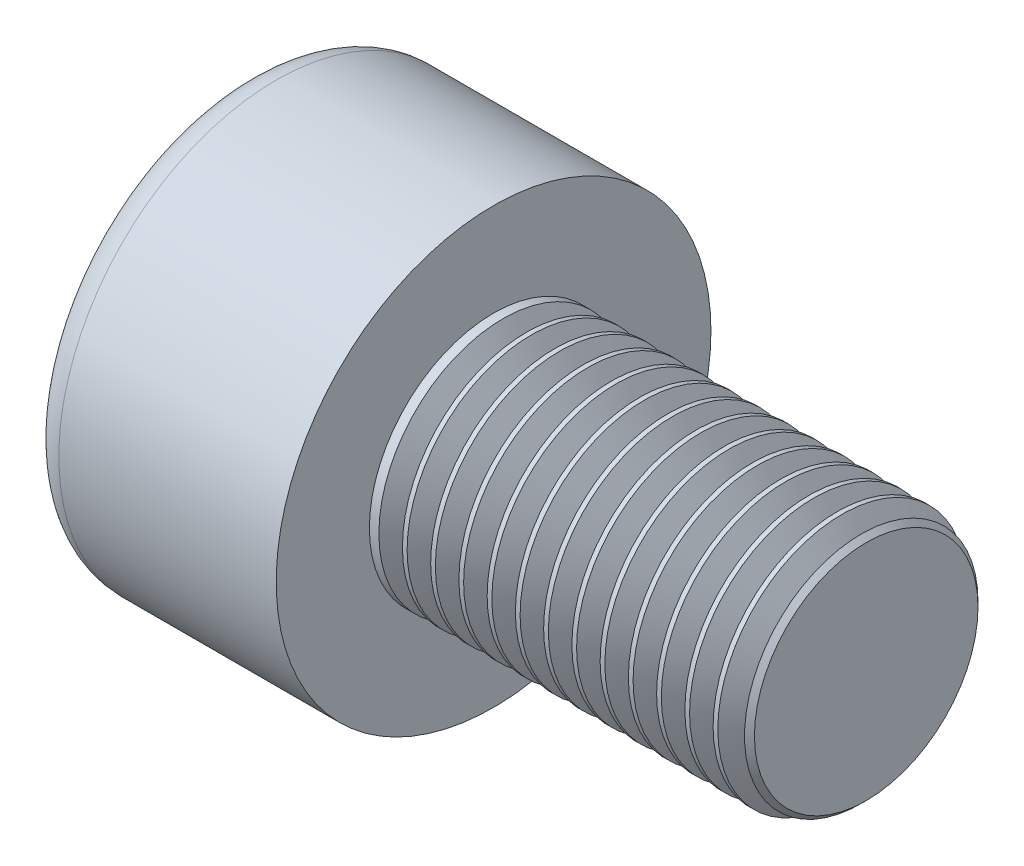
ISO-10303-21;
HEADER;
FILE_DESCRIPTION(('STEP AP214'),'2;1');
FILE_NAME('part.step','',(''),(''),'','','');
FILE_SCHEMA(('AUTOMOTIVE_DESIGN { 1 0 10303 214 1 1 1 1 }'));
ENDSEC;
DATA;
#1=APPLICATION_CONTEXT('core data for automotive mechanical design processes');
#2=APPLICATION_PROTOCOL_DEFINITION('international standard','automotive_design',2000,#1);
#3=PRODUCT_CONTEXT('',#1,'mechanical');
#4=PRODUCT('Part','Part','',(#3));
#5=PRODUCT_RELATED_PRODUCT_CATEGORY('part','',(#4));
#6=PRODUCT_DEFINITION_FORMATION('','',#4);
#7=PRODUCT_DEFINITION_CONTEXT('part definition',#1,'design');
#8=PRODUCT_DEFINITION('design','',#6,#7);
#9=PRODUCT_DEFINITION_SHAPE('','',#8);
#10=(LENGTH_UNIT() NAMED_UNIT(*) SI_UNIT(.MILLI.,.METRE.));
#11=(NAMED_UNIT(*) PLANE_ANGLE_UNIT() SI_UNIT($,.RADIAN.));
#12=(NAMED_UNIT(*) SI_UNIT($,.STERADIAN.) SOLID_ANGLE_UNIT());
#13=UNCERTAINTY_MEASURE_WITH_UNIT(LENGTH_MEASURE(1.E-05),#10,'distance_accuracy_value','');
#14=(GEOMETRIC_REPRESENTATION_CONTEXT(3) GLOBAL_UNCERTAINTY_ASSIGNED_CONTEXT((#13)) GLOBAL_UNIT_ASSIGNED_CONTEXT((#10,
#11,#12)) REPRESENTATION_CONTEXT('',''));
#15=CARTESIAN_POINT('',(0.,0.,0.));
#16=DIRECTION('',(0.,0.,1.));
#17=DIRECTION('',(1.,0.,0.));
#18=AXIS2_PLACEMENT_3D('',#15,#16,#17);
#19=CARTESIAN_POINT('',(10.,0.,0.));
#20=DIRECTION('',(-1.,0.,0.));
#21=DIRECTION('',(0.,0.,1.));
#22=AXIS2_PLACEMENT_3D('',#19,#20,#21);
#23=CYLINDRICAL_SURFACE('',#22,2.);
#24=CARTESIAN_POINT('',(4.6077,0.,0.));
#25=DIRECTION('',(-1.,0.,0.));
#26=DIRECTION('',(0.,0.,1.));
#27=AXIS2_PLACEMENT_3D('',#24,#25,#26);
#28=CIRCLE('',#27,2.);
#29=CARTESIAN_POINT('',(4.6077,0.,2.));
#30=VERTEX_POINT('',#29);
#31=EDGE_CURVE('E306',#30,#30,#28,.T.);
#32=ORIENTED_EDGE('',*,*,#31,.T.);
#33=EDGE_LOOP('',(#32));
#34=FACE_BOUND('',#33,.T.);
#35=CARTESIAN_POINT('',(4.5319,0.,0.));
#36=DIRECTION('',(-1.,0.,0.));
#37=DIRECTION('',(0.,0.,1.));
#38=AXIS2_PLACEMENT_3D('',#35,#36,#37);
#39=CIRCLE('',#38,2.);
#40=CARTESIAN_POINT('',(4.5319,0.,2.));
#41=VERTEX_POINT('',#40);
#42=EDGE_CURVE('E298',#41,#41,#39,.T.);
#43=ORIENTED_EDGE('',*,*,#42,.F.);
#44=EDGE_LOOP('',(#43));
#45=FACE_BOUND('',#44,.T.);
#46=ADVANCED_FACE('F37',(#34,#45),#23,.T.);
#47=CARTESIAN_POINT('',(5.0625,0.,0.));
#48=DIRECTION('',(-1.,0.,0.));
#49=DIRECTION('',(0.,0.,1.));
#50=AXIS2_PLACEMENT_3D('',#47,#48,#49);
#51=CIRCLE('',#50,2.);
#52=CARTESIAN_POINT('',(5.0625,0.,2.));
#53=VERTEX_POINT('',#52);
#54=EDGE_CURVE('E314',#53,#53,#51,.T.);
#55=ORIENTED_EDGE('',*,*,#54,.T.);
#56=EDGE_LOOP('',(#55));
#57=FACE_BOUND('',#56,.T.);
#58=CARTESIAN_POINT('',(4.9867,0.,0.));
#59=DIRECTION('',(-1.,0.,0.));
#60=DIRECTION('',(0.,0.,1.));
#61=AXIS2_PLACEMENT_3D('',#58,#59,#60);
#62=CIRCLE('',#61,2.);
#63=CARTESIAN_POINT('',(4.9867,0.,2.));
#64=VERTEX_POINT('',#63);
#65=EDGE_CURVE('E308',#64,#64,#62,.T.);
#66=ORIENTED_EDGE('',*,*,#65,.F.);
#67=EDGE_LOOP('',(#66));
#68=FACE_BOUND('',#67,.T.);
#69=ADVANCED_FACE('F130',(#57,#68),#23,.T.);
#70=CARTESIAN_POINT('',(5.5173,0.,0.));
#71=DIRECTION('',(-1.,0.,0.));
#72=DIRECTION('',(0.,0.,1.));
#73=AXIS2_PLACEMENT_3D('',#70,#71,#72);
#74=CIRCLE('',#73,2.);
#75=CARTESIAN_POINT('',(5.5173,0.,2.));
#76=VERTEX_POINT('',#75);
#77=EDGE_CURVE('E323',#76,#76,#74,.T.);
#78=ORIENTED_EDGE('',*,*,#77,.T.);
#79=EDGE_LOOP('',(#78));
#80=FACE_BOUND('',#79,.T.);
#81=CARTESIAN_POINT('',(5.4415,0.,0.));
#82=DIRECTION('',(-1.,0.,0.));
#83=DIRECTION('',(0.,0.,1.));
#84=AXIS2_PLACEMENT_3D('',#81,#82,#83);
#85=CIRCLE('',#84,2.);
#86=CARTESIAN_POINT('',(5.4415,0.,2.));
#87=VERTEX_POINT('',#86);
#88=EDGE_CURVE('E317',#87,#87,#85,.T.);
#89=ORIENTED_EDGE('',*,*,#88,.F.);
#90=EDGE_LOOP('',(#89));
#91=FACE_BOUND('',#90,.T.);
#92=ADVANCED_FACE('F138',(#80,#91),#23,.T.);
#93=CARTESIAN_POINT('',(5.9721,0.,0.));
#94=DIRECTION('',(-1.,0.,0.));
#95=DIRECTION('',(0.,0.,1.));
#96=AXIS2_PLACEMENT_3D('',#93,#94,#95);
#97=CIRCLE('',#96,2.);
#98=CARTESIAN_POINT('',(5.9721,0.,2.));
#99=VERTEX_POINT('',#98);
#100=EDGE_CURVE('E332',#99,#99,#97,.T.);
#101=ORIENTED_EDGE('',*,*,#100,.T.);
#102=EDGE_LOOP('',(#101));
#103=FACE_BOUND('',#102,.T.);
#104=CARTESIAN_POINT('',(5.8963,0.,0.));
#105=DIRECTION('',(-1.,0.,0.));
#106=DIRECTION('',(0.,0.,1.));
#107=AXIS2_PLACEMENT_3D('',#104,#105,#106);
#108=CIRCLE('',#107,2.);
#109=CARTESIAN_POINT('',(5.8963,0.,2.));
#110=VERTEX_POINT('',#109);
#111=EDGE_CURVE('E326',#110,#110,#108,.T.);
#112=ORIENTED_EDGE('',*,*,#111,.F.);
#113=EDGE_LOOP('',(#112));
#114=FACE_BOUND('',#113,.T.);
#115=ADVANCED_FACE('F608',(#103,#114),#23,.T.);
#116=CARTESIAN_POINT('',(6.4269,0.,0.));
#117=DIRECTION('',(-1.,0.,0.));
#118=DIRECTION('',(0.,0.,1.));
#119=AXIS2_PLACEMENT_3D('',#116,#117,#118);
#120=CIRCLE('',#119,2.);
#121=CARTESIAN_POINT('',(6.4269,0.,2.));
#122=VERTEX_POINT('',#121);
#123=EDGE_CURVE('E341',#122,#122,#120,.T.);
#124=ORIENTED_EDGE('',*,*,#123,.T.);
#125=EDGE_LOOP('',(#124));
#126=FACE_BOUND('',#125,.T.);
#127=CARTESIAN_POINT('',(6.3511,0.,0.));
#128=DIRECTION('',(-1.,0.,0.));
#129=DIRECTION('',(0.,0.,1.));
#130=AXIS2_PLACEMENT_3D('',#127,#128,#129);
#131=CIRCLE('',#130,2.);
#132=CARTESIAN_POINT('',(6.3511,0.,2.));
#133=VERTEX_POINT('',#132);
#134=EDGE_CURVE('E335',#133,#133,#131,.T.);
#135=ORIENTED_EDGE('',*,*,#134,.F.);
#136=EDGE_LOOP('',(#135));
#137=FACE_BOUND('',#136,.T.);
#138=ADVANCED_FACE('F617',(#126,#137),#23,.T.);
#139=CARTESIAN_POINT('',(6.8817,0.,0.));
#140=DIRECTION('',(-1.,0.,0.));
#141=DIRECTION('',(0.,0.,1.));
#142=AXIS2_PLACEMENT_3D('',#139,#140,#141);
#143=CIRCLE('',#142,2.);
#144=CARTESIAN_POINT('',(6.8817,0.,2.));
#145=VERTEX_POINT('',#144);
#146=EDGE_CURVE('E350',#145,#145,#143,.T.);
#147=ORIENTED_EDGE('',*,*,#146,.T.);
#148=EDGE_LOOP('',(#147));
#149=FACE_BOUND('',#148,.T.);
#150=CARTESIAN_POINT('',(6.8059,0.,0.));
#151=DIRECTION('',(-1.,0.,0.));
#152=DIRECTION('',(0.,0.,1.));
#153=AXIS2_PLACEMENT_3D('',#150,#151,#152);
#154=CIRCLE('',#153,2.);
#155=CARTESIAN_POINT('',(6.8059,0.,2.));
#156=VERTEX_POINT('',#155);
#157=EDGE_CURVE('E344',#156,#156,#154,.T.);
#158=ORIENTED_EDGE('',*,*,#157,.F.);
#159=EDGE_LOOP('',(#158));
#160=FACE_BOUND('',#159,.T.);
#161=ADVANCED_FACE('F626',(#149,#160),#23,.T.);
#162=CARTESIAN_POINT('',(7.3365,0.,0.));
#163=DIRECTION('',(-1.,0.,0.));
#164=DIRECTION('',(0.,0.,1.));
#165=AXIS2_PLACEMENT_3D('',#162,#163,#164);
#166=CIRCLE('',#165,2.);
#167=CARTESIAN_POINT('',(7.3365,0.,2.));
#168=VERTEX_POINT('',#167);
#169=EDGE_CURVE('E359',#168,#168,#166,.T.);
#170=ORIENTED_EDGE('',*,*,#169,.T.);
#171=EDGE_LOOP('',(#170));
#172=FACE_BOUND('',#171,.T.);
#173=CARTESIAN_POINT('',(7.2607,0.,0.));
#174=DIRECTION('',(-1.,0.,0.));
#175=DIRECTION('',(0.,0.,1.));
#176=AXIS2_PLACEMENT_3D('',#173,#174,#175);
#177=CIRCLE('',#176,2.);
#178=CARTESIAN_POINT('',(7.2607,0.,2.));
#179=VERTEX_POINT('',#178);
#180=EDGE_CURVE('E353',#179,#179,#177,.T.);
#181=ORIENTED_EDGE('',*,*,#180,.F.);
#182=EDGE_LOOP('',(#181));
#183=FACE_BOUND('',#182,.T.);
#184=ADVANCED_FACE('F635',(#172,#183),#23,.T.);
#185=CARTESIAN_POINT('',(7.7913,0.,0.));
#186=DIRECTION('',(-1.,0.,0.));
#187=DIRECTION('',(0.,0.,1.));
#188=AXIS2_PLACEMENT_3D('',#185,#186,#187);
#189=CIRCLE('',#188,2.);
#190=CARTESIAN_POINT('',(7.7913,0.,2.));
#191=VERTEX_POINT('',#190);
#192=EDGE_CURVE('E368',#191,#191,#189,.T.);
#193=ORIENTED_EDGE('',*,*,#192,.T.);
#194=EDGE_LOOP('',(#193));
#195=FACE_BOUND('',#194,.T.);
#196=CARTESIAN_POINT('',(7.7155,0.,0.));
#197=DIRECTION('',(-1.,0.,0.));
#198=DIRECTION('',(0.,0.,1.));
#199=AXIS2_PLACEMENT_3D('',#196,#197,#198);
#200=CIRCLE('',#199,2.);
#201=CARTESIAN_POINT('',(7.7155,0.,2.));
#202=VERTEX_POINT('',#201);
#203=EDGE_CURVE('E362',#202,#202,#200,.T.);
#204=ORIENTED_EDGE('',*,*,#203,.F.);
#205=EDGE_LOOP('',(#204));
#206=FACE_BOUND('',#205,.T.);
#207=ADVANCED_FACE('F644',(#195,#206),#23,.T.);
#208=CARTESIAN_POINT('',(8.2461,0.,0.));
#209=DIRECTION('',(-1.,0.,0.));
#210=DIRECTION('',(0.,0.,1.));
#211=AXIS2_PLACEMENT_3D('',#208,#209,#210);
#212=CIRCLE('',#211,2.);
#213=CARTESIAN_POINT('',(8.2461,0.,2.));
#214=VERTEX_POINT('',#213);
#215=EDGE_CURVE('E377',#214,#214,#212,.T.);
#216=ORIENTED_EDGE('',*,*,#215,.T.);
#217=EDGE_LOOP('',(#216));
#218=FACE_BOUND('',#217,.T.);
#219=CARTESIAN_POINT('',(8.1703,0.,0.));
#220=DIRECTION('',(-1.,0.,0.));
#221=DIRECTION('',(0.,0.,1.));
#222=AXIS2_PLACEMENT_3D('',#219,#220,#221);
#223=CIRCLE('',#222,2.);
#224=CARTESIAN_POINT('',(8.1703,0.,2.));
#225=VERTEX_POINT('',#224);
#226=EDGE_CURVE('E371',#225,#225,#223,.T.);
#227=ORIENTED_EDGE('',*,*,#226,.F.);
#228=EDGE_LOOP('',(#227));
#229=FACE_BOUND('',#228,.T.);
#230=ADVANCED_FACE('F174',(#218,#229),#23,.T.);
#231=CARTESIAN_POINT('',(8.7009,0.,0.));
#232=DIRECTION('',(-1.,0.,0.));
#233=DIRECTION('',(0.,0.,1.));
#234=AXIS2_PLACEMENT_3D('',#231,#232,#233);
#235=CIRCLE('',#234,2.);
#236=CARTESIAN_POINT('',(8.7009,0.,2.));
#237=VERTEX_POINT('',#236);
#238=EDGE_CURVE('E185',#237,#237,#235,.T.);
#239=ORIENTED_EDGE('',*,*,#238,.T.);
#240=EDGE_LOOP('',(#239));
#241=FACE_BOUND('',#240,.T.);
#242=CARTESIAN_POINT('',(8.6251,0.,0.));
#243=DIRECTION('',(-1.,0.,0.));
#244=DIRECTION('',(0.,0.,1.));
#245=AXIS2_PLACEMENT_3D('',#242,#243,#244);
#246=CIRCLE('',#245,2.);
#247=CARTESIAN_POINT('',(8.6251,0.,2.));
#248=VERTEX_POINT('',#247);
#249=EDGE_CURVE('E380',#248,#248,#246,.T.);
#250=ORIENTED_EDGE('',*,*,#249,.F.);
#251=EDGE_LOOP('',(#250));
#252=FACE_BOUND('',#251,.T.);
#253=ADVANCED_FACE('F165',(#241,#252),#23,.T.);
#254=CARTESIAN_POINT('',(9.1557,0.,0.));
#255=DIRECTION('',(-1.,0.,0.));
#256=DIRECTION('',(0.,0.,1.));
#257=AXIS2_PLACEMENT_3D('',#254,#255,#256);
#258=CIRCLE('',#257,2.);
#259=CARTESIAN_POINT('',(9.1557,0.,2.));
#260=VERTEX_POINT('',#259);
#261=EDGE_CURVE('E179',#260,#260,#258,.T.);
#262=ORIENTED_EDGE('',*,*,#261,.T.);
#263=EDGE_LOOP('',(#262));
#264=FACE_BOUND('',#263,.T.);
#265=CARTESIAN_POINT('',(9.0799,0.,0.));
#266=DIRECTION('',(-1.,0.,0.));
#267=DIRECTION('',(0.,0.,1.));
#268=AXIS2_PLACEMENT_3D('',#265,#266,#267);
#269=CIRCLE('',#268,2.);
#270=CARTESIAN_POINT('',(9.0799,0.,2.));
#271=VERTEX_POINT('',#270);
#272=EDGE_CURVE('E182',#271,#271,#269,.T.);
#273=ORIENTED_EDGE('',*,*,#272,.F.);
#274=EDGE_LOOP('',(#273));
#275=FACE_BOUND('',#274,.T.);
#276=ADVANCED_FACE('F151',(#264,#275),#23,.T.);
#277=CARTESIAN_POINT('',(9.1557,0.,0.));
#278=DIRECTION('',(-1.,0.,0.));
#279=DIRECTION('',(0.,0.,1.));
#280=AXIS2_PLACEMENT_3D('',#277,#278,#279);
#281=CONICAL_SURFACE('',#280,2.,1.0471975511966);
#282=CARTESIAN_POINT('',(9.3452,0.,0.));
#283=DIRECTION('',(-1.,0.,0.));
#284=DIRECTION('',(0.,0.,1.));
#285=AXIS2_PLACEMENT_3D('',#282,#283,#284);
#286=CIRCLE('',#285,1.6717763719657);
#287=CARTESIAN_POINT('',(9.3452,0.,1.6717763719657));
#288=VERTEX_POINT('',#287);
#289=EDGE_CURVE('E198',#288,#288,#286,.T.);
#290=ORIENTED_EDGE('',*,*,#289,.T.);
#291=EDGE_LOOP('',(#290));
#292=FACE_BOUND('',#291,.T.);
#293=ORIENTED_EDGE('',*,*,#261,.F.);
#294=EDGE_LOOP('',(#293));
#295=FACE_BOUND('',#294,.T.);
#296=ADVANCED_FACE('F164',(#292,#295),#281,.T.);
#297=CARTESIAN_POINT('',(9.3452,0.,0.));
#298=DIRECTION('',(1.,0.,0.));
#299=DIRECTION('',(0.,0.,-1.));
#300=AXIS2_PLACEMENT_3D('',#297,#298,#299);
#301=CONICAL_SURFACE('',#300,1.6717763719657,1.0471975511966);
#302=CARTESIAN_POINT('',(9.5347,0.,0.));
#303=DIRECTION('',(-1.,0.,0.));
#304=DIRECTION('',(0.,0.,1.));
#305=AXIS2_PLACEMENT_3D('',#302,#303,#304);
#306=CIRCLE('',#305,2.);
#307=CARTESIAN_POINT('',(9.5347,0.,2.));
#308=VERTEX_POINT('',#307);
#309=EDGE_CURVE('E195',#308,#308,#306,.T.);
#310=ORIENTED_EDGE('',*,*,#309,.T.);
#311=EDGE_LOOP('',(#310));
#312=FACE_BOUND('',#311,.T.);
#313=ORIENTED_EDGE('',*,*,#289,.F.);
#314=EDGE_LOOP('',(#313));
#315=FACE_BOUND('',#314,.T.);
#316=ADVANCED_FACE('F171',(#312,#315),#301,.T.);
#317=CARTESIAN_POINT('',(10.,0.,0.));
#318=DIRECTION('',(1.,0.,0.));
#319=DIRECTION('',(0.,0.,-1.));
#320=AXIS2_PLACEMENT_3D('',#317,#318,#319);
#321=PLANE('',#320);
#322=CARTESIAN_POINT('',(10.,0.,0.));
#323=DIRECTION('',(1.,0.,0.));
#324=DIRECTION('',(0.,0.,-1.));
#325=AXIS2_PLACEMENT_3D('',#322,#323,#324);
#326=CIRCLE('',#325,1.8);
#327=CARTESIAN_POINT('',(10.,0.,-1.8));
#328=VERTEX_POINT('',#327);
#329=EDGE_CURVE('E11',#328,#328,#326,.T.);
#330=ORIENTED_EDGE('',*,*,#329,.T.);
#331=EDGE_LOOP('',(#330));
#332=FACE_BOUND('',#331,.T.);
#333=ADVANCED_FACE('F406',(#332),#321,.T.);
#334=CARTESIAN_POINT('',(10.,0.,0.));
#335=DIRECTION('',(-1.,0.,0.));
#336=DIRECTION('',(0.,0.,1.));
#337=AXIS2_PLACEMENT_3D('',#334,#335,#336);
#338=CONICAL_SURFACE('',#337,1.8,0.785398163397448);
#339=ORIENTED_EDGE('',*,*,#329,.F.);
#340=EDGE_LOOP('',(#339));
#341=FACE_BOUND('',#340,.T.);
#342=CARTESIAN_POINT('',(9.92013818598285,0.,0.));
#343=DIRECTION('',(1.,0.,0.));
#344=DIRECTION('',(0.,0.,-1.));
#345=AXIS2_PLACEMENT_3D('',#342,#343,#344);
#346=CIRCLE('',#345,1.87986181401715);
#347=CARTESIAN_POINT('',(9.92013818598285,0.,-1.87986181401715));
#348=VERTEX_POINT('',#347);
#349=EDGE_CURVE('E41',#348,#348,#346,.T.);
#350=ORIENTED_EDGE('',*,*,#349,.T.);
#351=EDGE_LOOP('',(#350));
#352=FACE_BOUND('',#351,.T.);
#353=ADVANCED_FACE('F39',(#341,#352),#338,.T.);
#354=CARTESIAN_POINT('',(9.8,0.,0.));
#355=DIRECTION('',(1.,0.,0.));
#356=DIRECTION('',(0.,0.,-1.));
#357=AXIS2_PLACEMENT_3D('',#354,#355,#356);
#358=CONICAL_SURFACE('',#357,1.6717763719657,1.0471975511966);
#359=ORIENTED_EDGE('',*,*,#349,.F.);
#360=EDGE_LOOP('',(#359));
#361=FACE_BOUND('',#360,.T.);
#362=CARTESIAN_POINT('',(9.8,0.,0.));
#363=DIRECTION('',(-1.,0.,0.));
#364=DIRECTION('',(0.,0.,1.));
#365=AXIS2_PLACEMENT_3D('',#362,#363,#364);
#366=CIRCLE('',#365,1.6717763719657);
#367=CARTESIAN_POINT('',(9.8,0.,1.6717763719657));
#368=VERTEX_POINT('',#367);
#369=EDGE_CURVE('E203',#368,#368,#366,.T.);
#370=ORIENTED_EDGE('',*,*,#369,.F.);
#371=EDGE_LOOP('',(#370));
#372=FACE_BOUND('',#371,.T.);
#373=ADVANCED_FACE('F159',(#361,#372),#358,.T.);
#374=CARTESIAN_POINT('',(9.6105,0.,0.));
#375=DIRECTION('',(-1.,0.,0.));
#376=DIRECTION('',(0.,0.,1.));
#377=AXIS2_PLACEMENT_3D('',#374,#375,#376);
#378=CONICAL_SURFACE('',#377,2.,1.0471975511966);
#379=ORIENTED_EDGE('',*,*,#369,.T.);
#380=EDGE_LOOP('',(#379));
#381=FACE_BOUND('',#380,.T.);
#382=CARTESIAN_POINT('',(9.6105,0.,0.));
#383=DIRECTION('',(-1.,0.,0.));
#384=DIRECTION('',(0.,0.,1.));
#385=AXIS2_PLACEMENT_3D('',#382,#383,#384);
#386=CIRCLE('',#385,2.);
#387=CARTESIAN_POINT('',(9.6105,0.,2.));
#388=VERTEX_POINT('',#387);
#389=EDGE_CURVE('E201',#388,#388,#386,.T.);
#390=ORIENTED_EDGE('',*,*,#389,.F.);
#391=EDGE_LOOP('',(#390));
#392=FACE_BOUND('',#391,.T.);
#393=ADVANCED_FACE('F149',(#381,#392),#378,.T.);
#394=ORIENTED_EDGE('',*,*,#389,.T.);
#395=EDGE_LOOP('',(#394));
#396=FACE_BOUND('',#395,.T.);
#397=ORIENTED_EDGE('',*,*,#309,.F.);
#398=EDGE_LOOP('',(#397));
#399=FACE_BOUND('',#398,.T.);
#400=ADVANCED_FACE('F134',(#396,#399),#23,.T.);
#401=CARTESIAN_POINT('',(8.7009,0.,0.));
#402=DIRECTION('',(-1.,0.,0.));
#403=DIRECTION('',(0.,0.,1.));
#404=AXIS2_PLACEMENT_3D('',#401,#402,#403);
#405=CONICAL_SURFACE('',#404,2.,1.0471975511966);
#406=CARTESIAN_POINT('',(8.8904,0.,0.));
#407=DIRECTION('',(-1.,0.,0.));
#408=DIRECTION('',(0.,0.,1.));
#409=AXIS2_PLACEMENT_3D('',#406,#407,#408);
#410=CIRCLE('',#409,1.6717763719657);
#411=CARTESIAN_POINT('',(8.8904,0.,1.6717763719657));
#412=VERTEX_POINT('',#411);
#413=EDGE_CURVE('E184',#412,#412,#410,.T.);
#414=ORIENTED_EDGE('',*,*,#413,.T.);
#415=EDGE_LOOP('',(#414));
#416=FACE_BOUND('',#415,.T.);
#417=ORIENTED_EDGE('',*,*,#238,.F.);
#418=EDGE_LOOP('',(#417));
#419=FACE_BOUND('',#418,.T.);
#420=ADVANCED_FACE('F148',(#416,#419),#405,.T.);
#421=CARTESIAN_POINT('',(8.8904,0.,0.));
#422=DIRECTION('',(1.,0.,0.));
#423=DIRECTION('',(0.,0.,-1.));
#424=AXIS2_PLACEMENT_3D('',#421,#422,#423);
#425=CONICAL_SURFACE('',#424,1.6717763719657,1.0471975511966);
#426=ORIENTED_EDGE('',*,*,#272,.T.);
#427=EDGE_LOOP('',(#426));
#428=FACE_BOUND('',#427,.T.);
#429=ORIENTED_EDGE('',*,*,#413,.F.);
#430=EDGE_LOOP('',(#429));
#431=FACE_BOUND('',#430,.T.);
#432=ADVANCED_FACE('F156',(#428,#431),#425,.T.);
#433=CARTESIAN_POINT('',(8.2461,0.,0.));
#434=DIRECTION('',(-1.,0.,0.));
#435=DIRECTION('',(0.,0.,1.));
#436=AXIS2_PLACEMENT_3D('',#433,#434,#435);
#437=CONICAL_SURFACE('',#436,2.,1.0471975511966);
#438=CARTESIAN_POINT('',(8.4356,0.,0.));
#439=DIRECTION('',(-1.,0.,0.));
#440=DIRECTION('',(0.,0.,1.));
#441=AXIS2_PLACEMENT_3D('',#438,#439,#440);
#442=CIRCLE('',#441,1.6717763719657);
#443=CARTESIAN_POINT('',(8.4356,0.,1.6717763719657));
#444=VERTEX_POINT('',#443);
#445=EDGE_CURVE('E190',#444,#444,#442,.T.);
#446=ORIENTED_EDGE('',*,*,#445,.T.);
#447=EDGE_LOOP('',(#446));
#448=FACE_BOUND('',#447,.T.);
#449=ORIENTED_EDGE('',*,*,#215,.F.);
#450=EDGE_LOOP('',(#449));
#451=FACE_BOUND('',#450,.T.);
#452=ADVANCED_FACE('F385',(#448,#451),#437,.T.);
#453=CARTESIAN_POINT('',(8.4356,0.,0.));
#454=DIRECTION('',(1.,0.,0.));
#455=DIRECTION('',(0.,0.,-1.));
#456=AXIS2_PLACEMENT_3D('',#453,#454,#455);
#457=CONICAL_SURFACE('',#456,1.6717763719657,1.0471975511966);
#458=ORIENTED_EDGE('',*,*,#249,.T.);
#459=EDGE_LOOP('',(#458));
#460=FACE_BOUND('',#459,.T.);
#461=ORIENTED_EDGE('',*,*,#445,.F.);
#462=EDGE_LOOP('',(#461));
#463=FACE_BOUND('',#462,.T.);
#464=ADVANCED_FACE('F388',(#460,#463),#457,.T.);
#465=CARTESIAN_POINT('',(7.7913,0.,0.));
#466=DIRECTION('',(-1.,0.,0.));
#467=DIRECTION('',(0.,0.,1.));
#468=AXIS2_PLACEMENT_3D('',#465,#466,#467);
#469=CONICAL_SURFACE('',#468,2.,1.0471975511966);
#470=CARTESIAN_POINT('',(7.9808,0.,0.));
#471=DIRECTION('',(-1.,0.,0.));
#472=DIRECTION('',(0.,0.,1.));
#473=AXIS2_PLACEMENT_3D('',#470,#471,#472);
#474=CIRCLE('',#473,1.6717763719657);
#475=CARTESIAN_POINT('',(7.9808,0.,1.6717763719657));
#476=VERTEX_POINT('',#475);
#477=EDGE_CURVE('E374',#476,#476,#474,.T.);
#478=ORIENTED_EDGE('',*,*,#477,.T.);
#479=EDGE_LOOP('',(#478));
#480=FACE_BOUND('',#479,.T.);
#481=ORIENTED_EDGE('',*,*,#192,.F.);
#482=EDGE_LOOP('',(#481));
#483=FACE_BOUND('',#482,.T.);
#484=ADVANCED_FACE('F390',(#480,#483),#469,.T.);
#485=CARTESIAN_POINT('',(7.9808,0.,0.));
#486=DIRECTION('',(1.,0.,0.));
#487=DIRECTION('',(0.,0.,-1.));
#488=AXIS2_PLACEMENT_3D('',#485,#486,#487);
#489=CONICAL_SURFACE('',#488,1.6717763719657,1.0471975511966);
#490=ORIENTED_EDGE('',*,*,#226,.T.);
#491=EDGE_LOOP('',(#490));
#492=FACE_BOUND('',#491,.T.);
#493=ORIENTED_EDGE('',*,*,#477,.F.);
#494=EDGE_LOOP('',(#493));
#495=FACE_BOUND('',#494,.T.);
#496=ADVANCED_FACE('F397',(#492,#495),#489,.T.);
#497=CARTESIAN_POINT('',(7.3365,0.,0.));
#498=DIRECTION('',(-1.,0.,0.));
#499=DIRECTION('',(0.,0.,1.));
#500=AXIS2_PLACEMENT_3D('',#497,#498,#499);
#501=CONICAL_SURFACE('',#500,2.,1.0471975511966);
#502=CARTESIAN_POINT('',(7.526,0.,0.));
#503=DIRECTION('',(-1.,0.,0.));
#504=DIRECTION('',(0.,0.,1.));
#505=AXIS2_PLACEMENT_3D('',#502,#503,#504);
#506=CIRCLE('',#505,1.6717763719657);
#507=CARTESIAN_POINT('',(7.526,0.,1.6717763719657));
#508=VERTEX_POINT('',#507);
#509=EDGE_CURVE('E365',#508,#508,#506,.T.);
#510=ORIENTED_EDGE('',*,*,#509,.T.);
#511=EDGE_LOOP('',(#510));
#512=FACE_BOUND('',#511,.T.);
#513=ORIENTED_EDGE('',*,*,#169,.F.);
#514=EDGE_LOOP('',(#513));
#515=FACE_BOUND('',#514,.T.);
#516=ADVANCED_FACE('F723',(#512,#515),#501,.T.);
#517=CARTESIAN_POINT('',(7.526,0.,0.));
#518=DIRECTION('',(1.,0.,0.));
#519=DIRECTION('',(0.,0.,-1.));
#520=AXIS2_PLACEMENT_3D('',#517,#518,#519);
#521=CONICAL_SURFACE('',#520,1.6717763719657,1.0471975511966);
#522=ORIENTED_EDGE('',*,*,#203,.T.);
#523=EDGE_LOOP('',(#522));
#524=FACE_BOUND('',#523,.T.);
#525=ORIENTED_EDGE('',*,*,#509,.F.);
#526=EDGE_LOOP('',(#525));
#527=FACE_BOUND('',#526,.T.);
#528=ADVANCED_FACE('F732',(#524,#527),#521,.T.);
#529=CARTESIAN_POINT('',(6.8817,0.,0.));
#530=DIRECTION('',(-1.,0.,0.));
#531=DIRECTION('',(0.,0.,1.));
#532=AXIS2_PLACEMENT_3D('',#529,#530,#531);
#533=CONICAL_SURFACE('',#532,2.,1.0471975511966);
#534=CARTESIAN_POINT('',(7.0712,0.,0.));
#535=DIRECTION('',(-1.,0.,0.));
#536=DIRECTION('',(0.,0.,1.));
#537=AXIS2_PLACEMENT_3D('',#534,#535,#536);
#538=CIRCLE('',#537,1.6717763719657);
#539=CARTESIAN_POINT('',(7.0712,0.,1.6717763719657));
#540=VERTEX_POINT('',#539);
#541=EDGE_CURVE('E356',#540,#540,#538,.T.);
#542=ORIENTED_EDGE('',*,*,#541,.T.);
#543=EDGE_LOOP('',(#542));
#544=FACE_BOUND('',#543,.T.);
#545=ORIENTED_EDGE('',*,*,#146,.F.);
#546=EDGE_LOOP('',(#545));
#547=FACE_BOUND('',#546,.T.);
#548=ADVANCED_FACE('F742',(#544,#547),#533,.T.);
#549=CARTESIAN_POINT('',(7.0712,0.,0.));
#550=DIRECTION('',(1.,0.,0.));
#551=DIRECTION('',(0.,0.,-1.));
#552=AXIS2_PLACEMENT_3D('',#549,#550,#551);
#553=CONICAL_SURFACE('',#552,1.6717763719657,1.0471975511966);
#554=ORIENTED_EDGE('',*,*,#180,.T.);
#555=EDGE_LOOP('',(#554));
#556=FACE_BOUND('',#555,.T.);
#557=ORIENTED_EDGE('',*,*,#541,.F.);
#558=EDGE_LOOP('',(#557));
#559=FACE_BOUND('',#558,.T.);
#560=ADVANCED_FACE('F752',(#556,#559),#553,.T.);
#561=CARTESIAN_POINT('',(6.4269,0.,0.));
#562=DIRECTION('',(-1.,0.,0.));
#563=DIRECTION('',(0.,0.,1.));
#564=AXIS2_PLACEMENT_3D('',#561,#562,#563);
#565=CONICAL_SURFACE('',#564,2.,1.0471975511966);
#566=CARTESIAN_POINT('',(6.6164,0.,0.));
#567=DIRECTION('',(-1.,0.,0.));
#568=DIRECTION('',(0.,0.,1.));
#569=AXIS2_PLACEMENT_3D('',#566,#567,#568);
#570=CIRCLE('',#569,1.6717763719657);
#571=CARTESIAN_POINT('',(6.6164,0.,1.6717763719657));
#572=VERTEX_POINT('',#571);
#573=EDGE_CURVE('E347',#572,#572,#570,.T.);
#574=ORIENTED_EDGE('',*,*,#573,.T.);
#575=EDGE_LOOP('',(#574));
#576=FACE_BOUND('',#575,.T.);
#577=ORIENTED_EDGE('',*,*,#123,.F.);
#578=EDGE_LOOP('',(#577));
#579=FACE_BOUND('',#578,.T.);
#580=ADVANCED_FACE('F762',(#576,#579),#565,.T.);
#581=CARTESIAN_POINT('',(6.6164,0.,0.));
#582=DIRECTION('',(1.,0.,0.));
#583=DIRECTION('',(0.,0.,-1.));
#584=AXIS2_PLACEMENT_3D('',#581,#582,#583);
#585=CONICAL_SURFACE('',#584,1.6717763719657,1.0471975511966);
#586=ORIENTED_EDGE('',*,*,#157,.T.);
#587=EDGE_LOOP('',(#586));
#588=FACE_BOUND('',#587,.T.);
#589=ORIENTED_EDGE('',*,*,#573,.F.);
#590=EDGE_LOOP('',(#589));
#591=FACE_BOUND('',#590,.T.);
#592=ADVANCED_FACE('F772',(#588,#591),#585,.T.);
#593=CARTESIAN_POINT('',(5.9721,0.,0.));
#594=DIRECTION('',(-1.,0.,0.));
#595=DIRECTION('',(0.,0.,1.));
#596=AXIS2_PLACEMENT_3D('',#593,#594,#595);
#597=CONICAL_SURFACE('',#596,2.,1.0471975511966);
#598=CARTESIAN_POINT('',(6.1616,0.,0.));
#599=DIRECTION('',(-1.,0.,0.));
#600=DIRECTION('',(0.,0.,1.));
#601=AXIS2_PLACEMENT_3D('',#598,#599,#600);
#602=CIRCLE('',#601,1.6717763719657);
#603=CARTESIAN_POINT('',(6.1616,0.,1.6717763719657));
#604=VERTEX_POINT('',#603);
#605=EDGE_CURVE('E338',#604,#604,#602,.T.);
#606=ORIENTED_EDGE('',*,*,#605,.T.);
#607=EDGE_LOOP('',(#606));
#608=FACE_BOUND('',#607,.T.);
#609=ORIENTED_EDGE('',*,*,#100,.F.);
#610=EDGE_LOOP('',(#609));
#611=FACE_BOUND('',#610,.T.);
#612=ADVANCED_FACE('F782',(#608,#611),#597,.T.);
#613=CARTESIAN_POINT('',(6.1616,0.,0.));
#614=DIRECTION('',(1.,0.,0.));
#615=DIRECTION('',(0.,0.,-1.));
#616=AXIS2_PLACEMENT_3D('',#613,#614,#615);
#617=CONICAL_SURFACE('',#616,1.6717763719657,1.0471975511966);
#618=ORIENTED_EDGE('',*,*,#134,.T.);
#619=EDGE_LOOP('',(#618));
#620=FACE_BOUND('',#619,.T.);
#621=ORIENTED_EDGE('',*,*,#605,.F.);
#622=EDGE_LOOP('',(#621));
#623=FACE_BOUND('',#622,.T.);
#624=ADVANCED_FACE('F792',(#620,#623),#617,.T.);
#625=CARTESIAN_POINT('',(5.5173,0.,0.));
#626=DIRECTION('',(-1.,0.,0.));
#627=DIRECTION('',(0.,0.,1.));
#628=AXIS2_PLACEMENT_3D('',#625,#626,#627);
#629=CONICAL_SURFACE('',#628,2.,1.0471975511966);
#630=CARTESIAN_POINT('',(5.7068,0.,0.));
#631=DIRECTION('',(-1.,0.,0.));
#632=DIRECTION('',(0.,0.,1.));
#633=AXIS2_PLACEMENT_3D('',#630,#631,#632);
#634=CIRCLE('',#633,1.6717763719657);
#635=CARTESIAN_POINT('',(5.7068,0.,1.6717763719657));
#636=VERTEX_POINT('',#635);
#637=EDGE_CURVE('E329',#636,#636,#634,.T.);
#638=ORIENTED_EDGE('',*,*,#637,.T.);
#639=EDGE_LOOP('',(#638));
#640=FACE_BOUND('',#639,.T.);
#641=ORIENTED_EDGE('',*,*,#77,.F.);
#642=EDGE_LOOP('',(#641));
#643=FACE_BOUND('',#642,.T.);
#644=ADVANCED_FACE('F802',(#640,#643),#629,.T.);
#645=CARTESIAN_POINT('',(5.7068,0.,0.));
#646=DIRECTION('',(1.,0.,0.));
#647=DIRECTION('',(0.,0.,-1.));
#648=AXIS2_PLACEMENT_3D('',#645,#646,#647);
#649=CONICAL_SURFACE('',#648,1.6717763719657,1.0471975511966);
#650=ORIENTED_EDGE('',*,*,#111,.T.);
#651=EDGE_LOOP('',(#650));
#652=FACE_BOUND('',#651,.T.);
#653=ORIENTED_EDGE('',*,*,#637,.F.);
#654=EDGE_LOOP('',(#653));
#655=FACE_BOUND('',#654,.T.);
#656=ADVANCED_FACE('F812',(#652,#655),#649,.T.);
#657=CARTESIAN_POINT('',(5.0625,0.,0.));
#658=DIRECTION('',(-1.,0.,0.));
#659=DIRECTION('',(0.,0.,1.));
#660=AXIS2_PLACEMENT_3D('',#657,#658,#659);
#661=CONICAL_SURFACE('',#660,2.,1.0471975511966);
#662=CARTESIAN_POINT('',(5.252,0.,0.));
#663=DIRECTION('',(-1.,0.,0.));
#664=DIRECTION('',(0.,0.,1.));
#665=AXIS2_PLACEMENT_3D('',#662,#663,#664);
#666=CIRCLE('',#665,1.6717763719657);
#667=CARTESIAN_POINT('',(5.252,0.,1.6717763719657));
#668=VERTEX_POINT('',#667);
#669=EDGE_CURVE('E320',#668,#668,#666,.T.);
#670=ORIENTED_EDGE('',*,*,#669,.T.);
#671=EDGE_LOOP('',(#670));
#672=FACE_BOUND('',#671,.T.);
#673=ORIENTED_EDGE('',*,*,#54,.F.);
#674=EDGE_LOOP('',(#673));
#675=FACE_BOUND('',#674,.T.);
#676=ADVANCED_FACE('F822',(#672,#675),#661,.T.);
#677=CARTESIAN_POINT('',(5.252,0.,0.));
#678=DIRECTION('',(1.,0.,0.));
#679=DIRECTION('',(0.,0.,-1.));
#680=AXIS2_PLACEMENT_3D('',#677,#678,#679);
#681=CONICAL_SURFACE('',#680,1.6717763719657,1.0471975511966);
#682=ORIENTED_EDGE('',*,*,#88,.T.);
#683=EDGE_LOOP('',(#682));
#684=FACE_BOUND('',#683,.T.);
#685=ORIENTED_EDGE('',*,*,#669,.F.);
#686=EDGE_LOOP('',(#685));
#687=FACE_BOUND('',#686,.T.);
#688=ADVANCED_FACE('F832',(#684,#687),#681,.T.);
#689=CARTESIAN_POINT('',(4.6077,0.,0.));
#690=DIRECTION('',(-1.,0.,0.));
#691=DIRECTION('',(0.,0.,1.));
#692=AXIS2_PLACEMENT_3D('',#689,#690,#691);
#693=CONICAL_SURFACE('',#692,2.,1.0471975511966);
#694=CARTESIAN_POINT('',(4.7972,0.,0.));
#695=DIRECTION('',(-1.,0.,0.));
#696=DIRECTION('',(0.,0.,1.));
#697=AXIS2_PLACEMENT_3D('',#694,#695,#696);
#698=CIRCLE('',#697,1.6717763719657);
#699=CARTESIAN_POINT('',(4.7972,0.,1.6717763719657));
#700=VERTEX_POINT('',#699);
#701=EDGE_CURVE('E311',#700,#700,#698,.T.);
#702=ORIENTED_EDGE('',*,*,#701,.T.);
#703=EDGE_LOOP('',(#702));
#704=FACE_BOUND('',#703,.T.);
#705=ORIENTED_EDGE('',*,*,#31,.F.);
#706=EDGE_LOOP('',(#705));
#707=FACE_BOUND('',#706,.T.);
#708=ADVANCED_FACE('F842',(#704,#707),#693,.T.);
#709=CARTESIAN_POINT('',(4.7972,0.,0.));
#710=DIRECTION('',(1.,0.,0.));
#711=DIRECTION('',(0.,0.,-1.));
#712=AXIS2_PLACEMENT_3D('',#709,#710,#711);
#713=CONICAL_SURFACE('',#712,1.6717763719657,1.0471975511966);
#714=ORIENTED_EDGE('',*,*,#65,.T.);
#715=EDGE_LOOP('',(#714));
#716=FACE_BOUND('',#715,.T.);
#717=ORIENTED_EDGE('',*,*,#701,.F.);
#718=EDGE_LOOP('',(#717));
#719=FACE_BOUND('',#718,.T.);
#720=ADVANCED_FACE('F852',(#716,#719),#713,.T.);
#721=CARTESIAN_POINT('',(4.1529,0.,0.));
#722=DIRECTION('',(-1.,0.,0.));
#723=DIRECTION('',(0.,0.,1.));
#724=AXIS2_PLACEMENT_3D('',#721,#722,#723);
#725=CONICAL_SURFACE('',#724,2.,1.0471975511966);
#726=CARTESIAN_POINT('',(4.3424,0.,0.));
#727=DIRECTION('',(-1.,0.,0.));
#728=DIRECTION('',(0.,0.,1.));
#729=AXIS2_PLACEMENT_3D('',#726,#727,#728);
#730=CIRCLE('',#729,1.6717763719657);
#731=CARTESIAN_POINT('',(4.3424,0.,1.6717763719657));
#732=VERTEX_POINT('',#731);
#733=EDGE_CURVE('E301',#732,#732,#730,.T.);
#734=ORIENTED_EDGE('',*,*,#733,.T.);
#735=EDGE_LOOP('',(#734));
#736=FACE_BOUND('',#735,.T.);
#737=CARTESIAN_POINT('',(4.1529,0.,0.));
#738=DIRECTION('',(-1.,0.,0.));
#739=DIRECTION('',(0.,0.,1.));
#740=AXIS2_PLACEMENT_3D('',#737,#738,#739);
#741=CIRCLE('',#740,2.);
#742=CARTESIAN_POINT('',(4.1529,0.,2.));
#743=VERTEX_POINT('',#742);
#744=EDGE_CURVE('E296',#743,#743,#741,.T.);
#745=ORIENTED_EDGE('',*,*,#744,.F.);
#746=EDGE_LOOP('',(#745));
#747=FACE_BOUND('',#746,.T.);
#748=ADVANCED_FACE('F125',(#736,#747),#725,.T.);
#749=CARTESIAN_POINT('',(4.3424,0.,0.));
#750=DIRECTION('',(1.,0.,0.));
#751=DIRECTION('',(0.,0.,-1.));
#752=AXIS2_PLACEMENT_3D('',#749,#750,#751);
#753=CONICAL_SURFACE('',#752,1.6717763719657,1.0471975511966);
#754=ORIENTED_EDGE('',*,*,#42,.T.);
#755=EDGE_LOOP('',(#754));
#756=FACE_BOUND('',#755,.T.);
#757=ORIENTED_EDGE('',*,*,#733,.F.);
#758=EDGE_LOOP('',(#757));
#759=FACE_BOUND('',#758,.T.);
#760=ADVANCED_FACE('F115',(#756,#759),#753,.T.);
#761=CARTESIAN_POINT('',(2.,0.,0.));
#762=DIRECTION('',(-1.,0.,0.));
#763=DIRECTION('',(0.,0.,1.));
#764=AXIS2_PLACEMENT_3D('',#761,#762,#763);
#765=CONICAL_SURFACE('',#764,1.5,1.04719755119659);
#766=CARTESIAN_POINT('',(2.86602540378445,0.,0.));
#767=VERTEX_POINT('',#766);
#768=VERTEX_LOOP('',#767);
#769=FACE_BOUND('',#768,.T.);
#770=CARTESIAN_POINT('',(2.,0.,0.));
#771=DIRECTION('',(1.,0.,0.));
#772=DIRECTION('',(0.,0.,-1.));
#773=AXIS2_PLACEMENT_3D('',#770,#771,#772);
#774=CIRCLE('',#773,1.5);
#775=CARTESIAN_POINT('',(2.,0.750000000000001,-1.29903810567666));
#776=VERTEX_POINT('',#775);
#777=CARTESIAN_POINT('',(2.,1.5,0.));
#778=VERTEX_POINT('',#777);
#779=EDGE_CURVE('E53',#776,#778,#774,.T.);
#780=ORIENTED_EDGE('',*,*,#779,.F.);
#781=CARTESIAN_POINT('',(2.,0.,0.));
#782=DIRECTION('',(1.,0.,0.));
#783=DIRECTION('',(0.,0.,-1.));
#784=AXIS2_PLACEMENT_3D('',#781,#782,#783);
#785=CIRCLE('',#784,1.5);
#786=CARTESIAN_POINT('',(2.,-0.75,-1.29903810567666));
#787=VERTEX_POINT('',#786);
#788=EDGE_CURVE('E266',#776,#787,#785,.F.);
#789=ORIENTED_EDGE('',*,*,#788,.T.);
#790=CARTESIAN_POINT('',(2.,-1.5,0.));
#791=VERTEX_POINT('',#790);
#792=EDGE_CURVE('E269',#787,#791,#785,.F.);
#793=ORIENTED_EDGE('',*,*,#792,.T.);
#794=CARTESIAN_POINT('',(2.,-0.75,1.29903810567666));
#795=VERTEX_POINT('',#794);
#796=EDGE_CURVE('E465',#791,#795,#785,.F.);
#797=ORIENTED_EDGE('',*,*,#796,.T.);
#798=CARTESIAN_POINT('',(2.,0.75,1.29903810567666));
#799=VERTEX_POINT('',#798);
#800=EDGE_CURVE('E478',#795,#799,#785,.F.);
#801=ORIENTED_EDGE('',*,*,#800,.T.);
#802=EDGE_CURVE('E268',#799,#778,#785,.F.);
#803=ORIENTED_EDGE('',*,*,#802,.T.);
#804=EDGE_LOOP('',(#780,#789,#793,#797,#801,#803));
#805=FACE_BOUND('',#804,.T.);
#806=ADVANCED_FACE('F112',(#769,#805),#765,.F.);
#807=CARTESIAN_POINT('',(2.,0.,-1.73205080756888));
#808=DIRECTION('',(1.,0.,0.));
#809=DIRECTION('',(0.,0.,-1.));
#810=AXIS2_PLACEMENT_3D('',#807,#808,#809);
#811=PLANE('',#810);
#812=ORIENTED_EDGE('',*,*,#796,.F.);
#813=DIRECTION('',(0.,0.,-1.));
#814=VECTOR('',#813,1.);
#815=CARTESIAN_POINT('',(2.,-1.5,0.866025403784438));
#816=LINE('',#815,#814);
#817=CARTESIAN_POINT('',(2.,-1.5,0.866025403784438));
#818=VERTEX_POINT('',#817);
#819=EDGE_CURVE('E228',#818,#791,#816,.T.);
#820=ORIENTED_EDGE('',*,*,#819,.F.);
#821=DIRECTION('',(0.,-0.866025403784438,-0.5));
#822=VECTOR('',#821,1.);
#823=CARTESIAN_POINT('',(2.,0.,1.73205080756888));
#824=LINE('',#823,#822);
#825=EDGE_CURVE('E223',#795,#818,#824,.T.);
#826=ORIENTED_EDGE('',*,*,#825,.F.);
#827=EDGE_LOOP('',(#812,#820,#826));
#828=FACE_BOUND('',#827,.T.);
#829=ADVANCED_FACE('F114',(#828),#811,.F.);
#830=ORIENTED_EDGE('',*,*,#800,.F.);
#831=CARTESIAN_POINT('',(2.,0.,1.73205080756888));
#832=VERTEX_POINT('',#831);
#833=EDGE_CURVE('E224',#832,#795,#824,.T.);
#834=ORIENTED_EDGE('',*,*,#833,.F.);
#835=DIRECTION('',(0.,-0.866025403784439,0.5));
#836=VECTOR('',#835,1.);
#837=CARTESIAN_POINT('',(2.,1.5,0.866025403784439));
#838=LINE('',#837,#836);
#839=EDGE_CURVE('E219',#799,#832,#838,.T.);
#840=ORIENTED_EDGE('',*,*,#839,.F.);
#841=EDGE_LOOP('',(#830,#834,#840));
#842=FACE_BOUND('',#841,.T.);
#843=ADVANCED_FACE('F121',(#842),#811,.F.);
#844=ORIENTED_EDGE('',*,*,#802,.F.);
#845=CARTESIAN_POINT('',(2.,1.5,0.866025403784439));
#846=VERTEX_POINT('',#845);
#847=EDGE_CURVE('E220',#846,#799,#838,.T.);
#848=ORIENTED_EDGE('',*,*,#847,.F.);
#849=DIRECTION('',(0.,0.,1.));
#850=VECTOR('',#849,1.);
#851=CARTESIAN_POINT('',(2.,1.5,-0.866025403784438));
#852=LINE('',#851,#850);
#853=EDGE_CURVE('E215',#778,#846,#852,.T.);
#854=ORIENTED_EDGE('',*,*,#853,.F.);
#855=EDGE_LOOP('',(#844,#848,#854));
#856=FACE_BOUND('',#855,.T.);
#857=ADVANCED_FACE('F486',(#856),#811,.F.);
#858=ORIENTED_EDGE('',*,*,#779,.T.);
#859=CARTESIAN_POINT('',(2.,1.5,-0.866025403784438));
#860=VERTEX_POINT('',#859);
#861=EDGE_CURVE('E216',#860,#778,#852,.T.);
#862=ORIENTED_EDGE('',*,*,#861,.F.);
#863=DIRECTION('',(0.,0.866025403784438,0.5));
#864=VECTOR('',#863,1.);
#865=CARTESIAN_POINT('',(2.,0.,-1.73205080756888));
#866=LINE('',#865,#864);
#867=EDGE_CURVE('E210',#776,#860,#866,.T.);
#868=ORIENTED_EDGE('',*,*,#867,.F.);
#869=EDGE_LOOP('',(#858,#862,#868));
#870=FACE_BOUND('',#869,.T.);
#871=ADVANCED_FACE('F458',(#870),#811,.F.);
#872=ORIENTED_EDGE('',*,*,#788,.F.);
#873=CARTESIAN_POINT('',(2.,0.,-1.73205080756888));
#874=VERTEX_POINT('',#873);
#875=EDGE_CURVE('E212',#874,#776,#866,.T.);
#876=ORIENTED_EDGE('',*,*,#875,.F.);
#877=DIRECTION('',(0.,0.866025403784439,-0.5));
#878=VECTOR('',#877,1.);
#879=CARTESIAN_POINT('',(2.,-1.5,-0.866025403784439));
#880=LINE('',#879,#878);
#881=EDGE_CURVE('E211',#787,#874,#880,.T.);
#882=ORIENTED_EDGE('',*,*,#881,.F.);
#883=EDGE_LOOP('',(#872,#876,#882));
#884=FACE_BOUND('',#883,.T.);
#885=ADVANCED_FACE('F453',(#884),#811,.F.);
#886=ORIENTED_EDGE('',*,*,#792,.F.);
#887=CARTESIAN_POINT('',(2.,-1.5,-0.866025403784439));
#888=VERTEX_POINT('',#887);
#889=EDGE_CURVE('E207',#888,#787,#880,.T.);
#890=ORIENTED_EDGE('',*,*,#889,.F.);
#891=EDGE_CURVE('E227',#791,#888,#816,.T.);
#892=ORIENTED_EDGE('',*,*,#891,.F.);
#893=EDGE_LOOP('',(#886,#890,#892));
#894=FACE_BOUND('',#893,.T.);
#895=ADVANCED_FACE('F124',(#894),#811,.F.);
#896=CARTESIAN_POINT('',(2.,-1.5,0.866025403784438));
#897=DIRECTION('',(0.,1.,0.));
#898=DIRECTION('',(0.,0.,1.));
#899=AXIS2_PLACEMENT_3D('',#896,#897,#898);
#900=PLANE('',#899);
#901=DIRECTION('',(0.,0.,-1.));
#902=VECTOR('',#901,1.);
#903=CARTESIAN_POINT('',(0.,-1.5,0.866025403784438));
#904=LINE('',#903,#902);
#905=CARTESIAN_POINT('',(0.,-1.5,0.866025403784438));
#906=VERTEX_POINT('',#905);
#907=CARTESIAN_POINT('',(0.,-1.5,-0.866025403784439));
#908=VERTEX_POINT('',#907);
#909=EDGE_CURVE('E245',#906,#908,#904,.T.);
#910=ORIENTED_EDGE('',*,*,#909,.F.);
#911=DIRECTION('',(-1.,0.,0.));
#912=VECTOR('',#911,1.);
#913=CARTESIAN_POINT('',(2.,-1.5,0.866025403784438));
#914=LINE('',#913,#912);
#915=EDGE_CURVE('E249',#818,#906,#914,.T.);
#916=ORIENTED_EDGE('',*,*,#915,.F.);
#917=ORIENTED_EDGE('',*,*,#819,.T.);
#918=ORIENTED_EDGE('',*,*,#891,.T.);
#919=DIRECTION('',(-1.,0.,0.));
#920=VECTOR('',#919,1.);
#921=CARTESIAN_POINT('',(2.,-1.5,-0.866025403784439));
#922=LINE('',#921,#920);
#923=EDGE_CURVE('E231',#888,#908,#922,.T.);
#924=ORIENTED_EDGE('',*,*,#923,.T.);
#925=EDGE_LOOP('',(#910,#916,#917,#918,#924));
#926=FACE_BOUND('',#925,.T.);
#927=ADVANCED_FACE('F448',(#926),#900,.T.);
#928=CARTESIAN_POINT('',(2.,0.,1.73205080756888));
#929=DIRECTION('',(0.,0.5,-0.866025403784439));
#930=DIRECTION('',(0.,0.866025403784438,0.5));
#931=AXIS2_PLACEMENT_3D('',#928,#929,#930);
#932=PLANE('',#931);
#933=DIRECTION('',(0.,-0.866025403784438,-0.5));
#934=VECTOR('',#933,1.);
#935=CARTESIAN_POINT('',(0.,0.,1.73205080756888));
#936=LINE('',#935,#934);
#937=CARTESIAN_POINT('',(0.,0.,1.73205080756888));
#938=VERTEX_POINT('',#937);
#939=EDGE_CURVE('E242',#938,#906,#936,.T.);
#940=ORIENTED_EDGE('',*,*,#939,.F.);
#941=DIRECTION('',(-1.,0.,0.));
#942=VECTOR('',#941,1.);
#943=CARTESIAN_POINT('',(2.,0.,1.73205080756888));
#944=LINE('',#943,#942);
#945=EDGE_CURVE('E251',#832,#938,#944,.T.);
#946=ORIENTED_EDGE('',*,*,#945,.F.);
#947=ORIENTED_EDGE('',*,*,#833,.T.);
#948=ORIENTED_EDGE('',*,*,#825,.T.);
#949=ORIENTED_EDGE('',*,*,#915,.T.);
#950=EDGE_LOOP('',(#940,#946,#947,#948,#949));
#951=FACE_BOUND('',#950,.T.);
#952=ADVANCED_FACE('F444',(#951),#932,.T.);
#953=CARTESIAN_POINT('',(2.,1.5,0.866025403784439));
#954=DIRECTION('',(0.,-0.5,-0.866025403784439));
#955=DIRECTION('',(0.,0.866025403784439,-0.5));
#956=AXIS2_PLACEMENT_3D('',#953,#954,#955);
#957=PLANE('',#956);
#958=DIRECTION('',(0.,-0.866025403784439,0.5));
#959=VECTOR('',#958,1.);
#960=CARTESIAN_POINT('',(0.,1.5,0.866025403784439));
#961=LINE('',#960,#959);
#962=CARTESIAN_POINT('',(0.,1.5,0.866025403784439));
#963=VERTEX_POINT('',#962);
#964=EDGE_CURVE('E239',#963,#938,#961,.T.);
#965=ORIENTED_EDGE('',*,*,#964,.F.);
#966=DIRECTION('',(-1.,0.,0.));
#967=VECTOR('',#966,1.);
#968=CARTESIAN_POINT('',(2.,1.5,0.866025403784439));
#969=LINE('',#968,#967);
#970=EDGE_CURVE('E253',#846,#963,#969,.T.);
#971=ORIENTED_EDGE('',*,*,#970,.F.);
#972=ORIENTED_EDGE('',*,*,#847,.T.);
#973=ORIENTED_EDGE('',*,*,#839,.T.);
#974=ORIENTED_EDGE('',*,*,#945,.T.);
#975=EDGE_LOOP('',(#965,#971,#972,#973,#974));
#976=FACE_BOUND('',#975,.T.);
#977=ADVANCED_FACE('F440',(#976),#957,.T.);
#978=CARTESIAN_POINT('',(2.,1.5,-0.866025403784438));
#979=DIRECTION('',(0.,-1.,0.));
#980=DIRECTION('',(0.,0.,-1.));
#981=AXIS2_PLACEMENT_3D('',#978,#979,#980);
#982=PLANE('',#981);
#983=DIRECTION('',(0.,0.,1.));
#984=VECTOR('',#983,1.);
#985=CARTESIAN_POINT('',(0.,1.5,-0.866025403784438));
#986=LINE('',#985,#984);
#987=CARTESIAN_POINT('',(0.,1.5,-0.866025403784438));
#988=VERTEX_POINT('',#987);
#989=EDGE_CURVE('E236',#988,#963,#986,.T.);
#990=ORIENTED_EDGE('',*,*,#989,.F.);
#991=DIRECTION('',(-1.,0.,0.));
#992=VECTOR('',#991,1.);
#993=CARTESIAN_POINT('',(2.,1.5,-0.866025403784438));
#994=LINE('',#993,#992);
#995=EDGE_CURVE('E255',#860,#988,#994,.T.);
#996=ORIENTED_EDGE('',*,*,#995,.F.);
#997=ORIENTED_EDGE('',*,*,#861,.T.);
#998=ORIENTED_EDGE('',*,*,#853,.T.);
#999=ORIENTED_EDGE('',*,*,#970,.T.);
#1000=EDGE_LOOP('',(#990,#996,#997,#998,#999));
#1001=FACE_BOUND('',#1000,.T.);
#1002=ADVANCED_FACE('F436',(#1001),#982,.T.);
#1003=CARTESIAN_POINT('',(2.,0.,-1.73205080756888));
#1004=DIRECTION('',(0.,-0.5,0.866025403784438));
#1005=DIRECTION('',(0.,-0.866025403784438,-0.5));
#1006=AXIS2_PLACEMENT_3D('',#1003,#1004,#1005);
#1007=PLANE('',#1006);
#1008=DIRECTION('',(0.,0.866025403784438,0.5));
#1009=VECTOR('',#1008,1.);
#1010=CARTESIAN_POINT('',(0.,0.,-1.73205080756888));
#1011=LINE('',#1010,#1009);
#1012=CARTESIAN_POINT('',(0.,0.,-1.73205080756888));
#1013=VERTEX_POINT('',#1012);
#1014=EDGE_CURVE('E233',#1013,#988,#1011,.T.);
#1015=ORIENTED_EDGE('',*,*,#1014,.F.);
#1016=DIRECTION('',(-1.,0.,0.));
#1017=VECTOR('',#1016,1.);
#1018=CARTESIAN_POINT('',(2.,0.,-1.73205080756888));
#1019=LINE('',#1018,#1017);
#1020=EDGE_CURVE('E257',#874,#1013,#1019,.T.);
#1021=ORIENTED_EDGE('',*,*,#1020,.F.);
#1022=ORIENTED_EDGE('',*,*,#875,.T.);
#1023=ORIENTED_EDGE('',*,*,#867,.T.);
#1024=ORIENTED_EDGE('',*,*,#995,.T.);
#1025=EDGE_LOOP('',(#1015,#1021,#1022,#1023,#1024));
#1026=FACE_BOUND('',#1025,.T.);
#1027=ADVANCED_FACE('F433',(#1026),#1007,.T.);
#1028=CARTESIAN_POINT('',(2.,-1.5,-0.866025403784439));
#1029=DIRECTION('',(0.,0.5,0.866025403784439));
#1030=DIRECTION('',(0.,-0.866025403784439,0.5));
#1031=AXIS2_PLACEMENT_3D('',#1028,#1029,#1030);
#1032=PLANE('',#1031);
#1033=DIRECTION('',(0.,0.866025403784439,-0.5));
#1034=VECTOR('',#1033,1.);
#1035=CARTESIAN_POINT('',(0.,-1.5,-0.866025403784439));
#1036=LINE('',#1035,#1034);
#1037=EDGE_CURVE('E61',#908,#1013,#1036,.T.);
#1038=ORIENTED_EDGE('',*,*,#1037,.F.);
#1039=ORIENTED_EDGE('',*,*,#923,.F.);
#1040=ORIENTED_EDGE('',*,*,#889,.T.);
#1041=ORIENTED_EDGE('',*,*,#881,.T.);
#1042=ORIENTED_EDGE('',*,*,#1020,.T.);
#1043=EDGE_LOOP('',(#1038,#1039,#1040,#1041,#1042));
#1044=FACE_BOUND('',#1043,.T.);
#1045=ADVANCED_FACE('F430',(#1044),#1032,.T.);
#1046=CARTESIAN_POINT('',(0.,0.,0.));
#1047=DIRECTION('',(1.,0.,0.));
#1048=DIRECTION('',(0.,0.,-1.));
#1049=AXIS2_PLACEMENT_3D('',#1046,#1047,#1048);
#1050=PLANE('',#1049);
#1051=CARTESIAN_POINT('',(0.,0.,0.));
#1052=DIRECTION('',(1.,0.,0.));
#1053=DIRECTION('',(0.,0.,-1.));
#1054=AXIS2_PLACEMENT_3D('',#1051,#1052,#1053);
#1055=CIRCLE('',#1054,3.);
#1056=CARTESIAN_POINT('',(0.,0.,-3.));
#1057=VERTEX_POINT('',#1056);
#1058=EDGE_CURVE('E46',#1057,#1057,#1055,.F.);
#1059=ORIENTED_EDGE('',*,*,#1058,.T.);
#1060=EDGE_LOOP('',(#1059));
#1061=FACE_BOUND('',#1060,.T.);
#1062=ORIENTED_EDGE('',*,*,#1037,.T.);
#1063=ORIENTED_EDGE('',*,*,#1014,.T.);
#1064=ORIENTED_EDGE('',*,*,#989,.T.);
#1065=ORIENTED_EDGE('',*,*,#964,.T.);
#1066=ORIENTED_EDGE('',*,*,#939,.T.);
#1067=ORIENTED_EDGE('',*,*,#909,.T.);
#1068=EDGE_LOOP('',(#1062,#1063,#1064,#1065,#1066,#1067));
#1069=FACE_BOUND('',#1068,.T.);
#1070=ADVANCED_FACE('F276',(#1061,#1069),#1050,.F.);
#1071=CARTESIAN_POINT('',(0.5,0.,0.));
#1072=DIRECTION('',(1.,0.,0.));
#1073=DIRECTION('',(0.,0.,-1.));
#1074=AXIS2_PLACEMENT_3D('',#1071,#1072,#1073);
#1075=TOROIDAL_SURFACE('',#1074,3.,0.5);
#1076=ORIENTED_EDGE('',*,*,#1058,.F.);
#1077=EDGE_LOOP('',(#1076));
#1078=FACE_BOUND('',#1077,.T.);
#1079=CARTESIAN_POINT('',(0.5,0.,0.));
#1080=DIRECTION('',(1.,0.,0.));
#1081=DIRECTION('',(0.,0.,-1.));
#1082=AXIS2_PLACEMENT_3D('',#1079,#1080,#1081);
#1083=CIRCLE('',#1082,3.5);
#1084=CARTESIAN_POINT('',(0.5,0.,-3.5));
#1085=VERTEX_POINT('',#1084);
#1086=EDGE_CURVE('E270',#1085,#1085,#1083,.T.);
#1087=ORIENTED_EDGE('',*,*,#1086,.F.);
#1088=EDGE_LOOP('',(#1087));
#1089=FACE_BOUND('',#1088,.T.);
#1090=ADVANCED_FACE('F279',(#1078,#1089),#1075,.T.);
#1091=CARTESIAN_POINT('',(4.,0.,0.));
#1092=DIRECTION('',(-1.,0.,0.));
#1093=DIRECTION('',(0.,0.,1.));
#1094=AXIS2_PLACEMENT_3D('',#1091,#1092,#1093);
#1095=CYLINDRICAL_SURFACE('',#1094,3.5);
#1096=ORIENTED_EDGE('',*,*,#1086,.T.);
#1097=EDGE_LOOP('',(#1096));
#1098=FACE_BOUND('',#1097,.T.);
#1099=CARTESIAN_POINT('',(4.,0.,0.));
#1100=DIRECTION('',(1.,0.,0.));
#1101=DIRECTION('',(0.,0.,-1.));
#1102=AXIS2_PLACEMENT_3D('',#1099,#1100,#1101);
#1103=CIRCLE('',#1102,3.5);
#1104=CARTESIAN_POINT('',(4.,0.,-3.5));
#1105=VERTEX_POINT('',#1104);
#1106=EDGE_CURVE('E262',#1105,#1105,#1103,.T.);
#1107=ORIENTED_EDGE('',*,*,#1106,.F.);
#1108=EDGE_LOOP('',(#1107));
#1109=FACE_BOUND('',#1108,.T.);
#1110=ADVANCED_FACE('F282',(#1098,#1109),#1095,.T.);
#1111=CARTESIAN_POINT('',(4.,0.,0.));
#1112=DIRECTION('',(1.,0.,0.));
#1113=DIRECTION('',(0.,0.,-1.));
#1114=AXIS2_PLACEMENT_3D('',#1111,#1112,#1113);
#1115=PLANE('',#1114);
#1116=ORIENTED_EDGE('',*,*,#1106,.T.);
#1117=EDGE_LOOP('',(#1116));
#1118=FACE_BOUND('',#1117,.T.);
#1119=CARTESIAN_POINT('',(4.,0.,0.));
#1120=DIRECTION('',(1.,0.,0.));
#1121=DIRECTION('',(0.,0.,-1.));
#1122=AXIS2_PLACEMENT_3D('',#1119,#1120,#1121);
#1123=CIRCLE('',#1122,2.);
#1124=CARTESIAN_POINT('',(4.,0.,-2.));
#1125=VERTEX_POINT('',#1124);
#1126=EDGE_CURVE('E259',#1125,#1125,#1123,.T.);
#1127=ORIENTED_EDGE('',*,*,#1126,.F.);
#1128=EDGE_LOOP('',(#1127));
#1129=FACE_BOUND('',#1128,.T.);
#1130=ADVANCED_FACE('F145',(#1118,#1129),#1115,.T.);
#1131=ORIENTED_EDGE('',*,*,#1126,.T.);
#1132=EDGE_LOOP('',(#1131));
#1133=FACE_BOUND('',#1132,.T.);
#1134=ORIENTED_EDGE('',*,*,#744,.T.);
#1135=EDGE_LOOP('',(#1134));
#1136=FACE_BOUND('',#1135,.T.);
#1137=ADVANCED_FACE('F133',(#1133,#1136),#23,.T.);
#1138=CLOSED_SHELL('',(#46,#69,#92,#115,#138,#161,#184,#207,#230,#253,#276,#296,#316,#333,#353,
#373,#393,#400,#420,#432,#452,#464,#484,#496,#516,#528,#548,#560,#580,#592,#612,#624,#644,#656,
#676,#688,#708,#720,#748,#760,#806,#829,#843,#857,#871,#885,#895,#927,#952,#977,#1002,#1027,
#1045,#1070,#1090,#1110,#1130,#1137));
#1139=MANIFOLD_SOLID_BREP('B2',#1138);
#1140=ADVANCED_BREP_SHAPE_REPRESENTATION('',(#18,#1139),#14);
#1141=SHAPE_DEFINITION_REPRESENTATION(#9,#1140);
ENDSEC;
END-ISO-10303-21;
